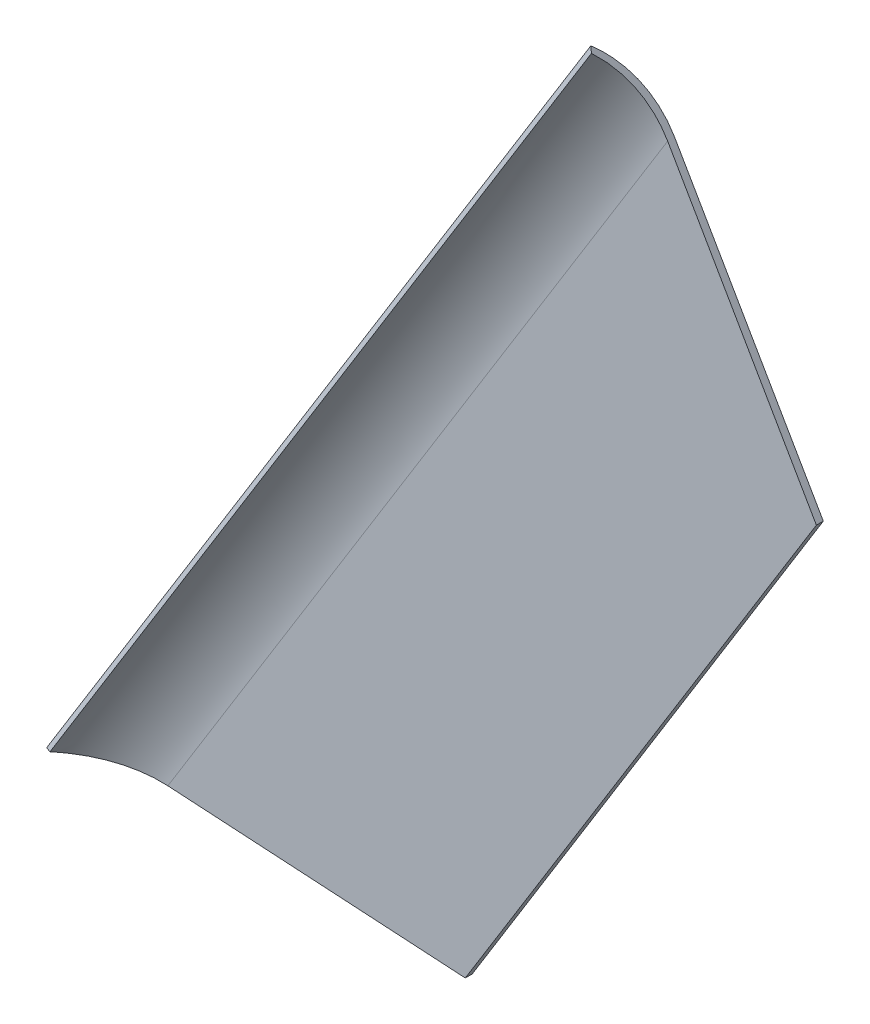
ISO-10303-21;
HEADER;
FILE_DESCRIPTION(('STEP AP214'),'2;1');
FILE_NAME('part.step','',(''),(''),'','','');
FILE_SCHEMA(('AUTOMOTIVE_DESIGN { 1 0 10303 214 1 1 1 1 }'));
ENDSEC;
DATA;
#1=APPLICATION_CONTEXT('core data for automotive mechanical design processes');
#2=APPLICATION_PROTOCOL_DEFINITION('international standard','automotive_design',2000,#1);
#3=PRODUCT_CONTEXT('',#1,'mechanical');
#4=PRODUCT('Part','Part','',(#3));
#5=PRODUCT_RELATED_PRODUCT_CATEGORY('part','',(#4));
#6=PRODUCT_DEFINITION_FORMATION('','',#4);
#7=PRODUCT_DEFINITION_CONTEXT('part definition',#1,'design');
#8=PRODUCT_DEFINITION('design','',#6,#7);
#9=PRODUCT_DEFINITION_SHAPE('','',#8);
#10=(LENGTH_UNIT() NAMED_UNIT(*) SI_UNIT(.MILLI.,.METRE.));
#11=(NAMED_UNIT(*) PLANE_ANGLE_UNIT() SI_UNIT($,.RADIAN.));
#12=(NAMED_UNIT(*) SI_UNIT($,.STERADIAN.) SOLID_ANGLE_UNIT());
#13=UNCERTAINTY_MEASURE_WITH_UNIT(LENGTH_MEASURE(1.E-05),#10,'distance_accuracy_value','');
#14=(GEOMETRIC_REPRESENTATION_CONTEXT(3) GLOBAL_UNCERTAINTY_ASSIGNED_CONTEXT((#13)) GLOBAL_UNIT_ASSIGNED_CONTEXT((#10,
#11,#12)) REPRESENTATION_CONTEXT('',''));
#15=CARTESIAN_POINT('',(0.,0.,0.));
#16=DIRECTION('',(0.,0.,1.));
#17=DIRECTION('',(1.,0.,0.));
#18=AXIS2_PLACEMENT_3D('',#15,#16,#17);
#19=CARTESIAN_POINT('',(-55.5895277832221,-99.2786334856322,1.5875));
#20=DIRECTION('',(0.0594751367438468,0.998229787228021,0.));
#21=DIRECTION('',(-0.998229787228021,0.0594751367438468,0.));
#22=AXIS2_PLACEMENT_3D('',#19,#20,#21);
#23=PLANE('',#22);
#24=DIRECTION('',(0.998229787228021,-0.0594751367438468,0.));
#25=VECTOR('',#24,1.);
#26=CARTESIAN_POINT('',(-55.5895277832221,-99.2786334856322,0.));
#27=LINE('',#26,#25);
#28=CARTESIAN_POINT('',(-123.629375350758,-95.2247780608739,0.));
#29=VERTEX_POINT('',#28);
#30=CARTESIAN_POINT('',(-55.5895277832221,-99.2786334856322,0.));
#31=VERTEX_POINT('',#30);
#32=EDGE_CURVE('E121',#29,#31,#27,.T.);
#33=ORIENTED_EDGE('',*,*,#32,.T.);
#34=DIRECTION('',(0.,0.,-1.));
#35=VECTOR('',#34,1.);
#36=CARTESIAN_POINT('',(-55.5895277832221,-99.2786334856322,1.5875));
#37=LINE('',#36,#35);
#38=CARTESIAN_POINT('',(-55.5895277832221,-99.2786334856322,1.5875));
#39=VERTEX_POINT('',#38);
#40=EDGE_CURVE('E134',#39,#31,#37,.T.);
#41=ORIENTED_EDGE('',*,*,#40,.F.);
#42=DIRECTION('',(0.998229787228021,-0.0594751367438468,0.));
#43=VECTOR('',#42,1.);
#44=CARTESIAN_POINT('',(-55.5895277832221,-99.2786334856322,1.5875));
#45=LINE('',#44,#43);
#46=CARTESIAN_POINT('',(-123.629375350758,-95.2247780608739,1.58750000000015));
#47=VERTEX_POINT('',#46);
#48=EDGE_CURVE('E149',#47,#39,#45,.T.);
#49=ORIENTED_EDGE('',*,*,#48,.F.);
#50=CARTESIAN_POINT('',(-123.629375350739,-95.2247780608751,1.58750000000014));
#51=CARTESIAN_POINT('',(-124.021621942274,-95.2014077708202,1.5875017836684));
#52=CARTESIAN_POINT('',(-124.413803393438,-95.1780413618683,1.59661545597952));
#53=CARTESIAN_POINT('',(-125.197315950276,-95.131359208065,1.63280106359393));
#54=CARTESIAN_POINT('',(-125.588647109861,-95.1080434600015,1.65987182491343));
#55=CARTESIAN_POINT('',(-126.7597976029,-95.038265602626,1.76757141818287));
#56=CARTESIAN_POINT('',(-127.537342907358,-94.9919389813422,1.87468834625455));
#57=CARTESIAN_POINT('',(-129.051564481433,-94.9017207406818,2.15183464576496));
#58=CARTESIAN_POINT('',(-129.788694564487,-94.8578020828251,2.31941606223591));
#59=CARTESIAN_POINT('',(-131.2465427355,-94.7709426037431,2.71530661956087));
#60=CARTESIAN_POINT('',(-131.96726054522,-94.7280017990954,2.94361678912631));
#61=CARTESIAN_POINT('',(-133.387370924641,-94.6433907605469,3.45824401496372));
#62=CARTESIAN_POINT('',(-134.086772118237,-94.6017200128291,3.74453724526653));
#63=CARTESIAN_POINT('',(-135.460509912841,-94.5198718810366,4.37259329154007));
#64=CARTESIAN_POINT('',(-136.134840803504,-94.4796948371876,4.71436865087235));
#65=CARTESIAN_POINT('',(-137.331923758195,-94.4083719080035,5.38232249283429));
#66=CARTESIAN_POINT('',(-137.859616528465,-94.3769316523909,5.69966379656906));
#67=CARTESIAN_POINT('',(-138.893615369694,-94.3153253736945,6.36785040769028));
#68=CARTESIAN_POINT('',(-139.399916609416,-94.2851596384586,6.71870322586202));
#69=CARTESIAN_POINT('',(-140.389690423424,-94.2261883137328,7.45283863979769));
#70=CARTESIAN_POINT('',(-140.873127624243,-94.1973848318155,7.83616907958481));
#71=CARTESIAN_POINT('',(-141.814271804994,-94.1413108901619,8.63310784203082));
#72=CARTESIAN_POINT('',(-142.271984547685,-94.1140400870771,9.04670933522815));
#73=CARTESIAN_POINT('',(-142.715899858538,-94.0875913433574,9.4746843536583));
#74=B_SPLINE_CURVE_WITH_KNOTS('',3,(#50,#51,#52,#53,#54,#55,#56,#57,#58,#59,#60,#61,#62,#63,#64,
#65,#66,#67,#68,#69,#70,#71,#72,#73),.UNSPECIFIED.,.F.,.F.,(4,2,2,2,2,2,2,2,2,2,2,4),(0.,
1.17859704859306,2.35711705142994,4.7124535194218,6.98152242443405,9.25062976866482,
11.5188065930223,13.7874969212132,15.6359613461725,17.4848410356645,19.3364933833065,
21.1877292592593),.UNSPECIFIED.);
#75=CARTESIAN_POINT('',(-142.715899858538,-94.0875913433575,9.47468435365827));
#76=VERTEX_POINT('',#75);
#77=EDGE_CURVE('E141',#47,#76,#74,.T.);
#78=ORIENTED_EDGE('',*,*,#77,.T.);
#79=DIRECTION('',(-0.945686977317728,0.0563446042308866,-0.320158439691543));
#80=VECTOR('',#79,1.);
#81=CARTESIAN_POINT('',(-144.438670833923,-93.9849476027575,8.89144731999463));
#82=LINE('',#81,#80);
#83=CARTESIAN_POINT('',(-143.84886680201,-94.0200884850463,9.09112305108765));
#84=VERTEX_POINT('',#83);
#85=EDGE_CURVE('E63',#76,#84,#82,.T.);
#86=ORIENTED_EDGE('',*,*,#85,.T.);
#87=CARTESIAN_POINT('',(-123.629375350797,-95.2247780608716,22.0306873384205));
#88=DIRECTION('',(0.0594751367438446,0.998229787228021,0.));
#89=DIRECTION('',(0.998229787228022,-0.0594751367438447,0.));
#90=AXIS2_PLACEMENT_3D('',#87,#88,#89);
#91=ELLIPSE('',#90,25.0270466695622,22.0306873384203);
#92=CARTESIAN_POINT('',(-143.46087523755,-94.0432052580047,8.6323164413553));
#93=VERTEX_POINT('',#92);
#94=EDGE_CURVE('E49',#84,#93,#91,.F.);
#95=ORIENTED_EDGE('',*,*,#94,.T.);
#96=CARTESIAN_POINT('',(-143.460875237551,-94.0432052580047,8.6323164413548));
#97=CARTESIAN_POINT('',(-142.91682645713,-94.0756200146318,8.06769626497914));
#98=CARTESIAN_POINT('',(-142.349568074535,-94.1094176134467,7.52555391455765));
#99=CARTESIAN_POINT('',(-141.172656346858,-94.1795387286795,6.48951692224252));
#100=CARTESIAN_POINT('',(-140.563000190152,-94.2158624126156,5.99562548535783));
#101=CARTESIAN_POINT('',(-139.305383986037,-94.2907919495498,5.05945339748532));
#102=CARTESIAN_POINT('',(-138.657423544247,-94.3293978260456,4.61717327802767));
#103=CARTESIAN_POINT('',(-137.327475042766,-94.4086369651696,3.78745684745309));
#104=CARTESIAN_POINT('',(-136.645488883392,-94.4492701145758,3.40001747813921));
#105=CARTESIAN_POINT('',(-135.259702007809,-94.531836137928,2.68714612990978));
#106=CARTESIAN_POINT('',(-134.556241033495,-94.5737487698456,2.36105417293373));
#107=CARTESIAN_POINT('',(-133.482784806124,-94.6377059435628,1.91664739681631));
#108=CARTESIAN_POINT('',(-133.121880157014,-94.6592088616603,1.7759536394577));
#109=CARTESIAN_POINT('',(-132.394450988439,-94.702549533143,1.50978830258103));
#110=CARTESIAN_POINT('',(-132.027925609112,-94.7243873377592,1.38431907882061));
#111=CARTESIAN_POINT('',(-131.012248601643,-94.7849019904771,1.06045815085895));
#112=CARTESIAN_POINT('',(-130.357887244356,-94.8238892374041,0.878205208541197));
#113=CARTESIAN_POINT('',(-129.037229031922,-94.9025748554666,0.563472739145026));
#114=CARTESIAN_POINT('',(-128.370929597479,-94.9422733802781,0.431004107513129));
#115=CARTESIAN_POINT('',(-127.027611186225,-95.0223091067431,0.217246052052937));
#116=CARTESIAN_POINT('',(-126.350561626709,-95.0626481305328,0.136148183878975));
#117=CARTESIAN_POINT('',(-124.992167923751,-95.1435820520298,0.0275045498095013));
#118=CARTESIAN_POINT('',(-124.310823510659,-95.1841769658029,-3.78193598088749E-05));
#119=CARTESIAN_POINT('',(-123.629375350758,-95.2247780608739,0.));
#120=B_SPLINE_CURVE_WITH_KNOTS('',3,(#96,#97,#98,#99,#100,#101,#102,#103,#104,#105,#106,#107,
#108,#109,#110,#111,#112,#113,#114,#115,#116,#117,#118,#119),.UNSPECIFIED.,.F.,.F.,(4,2,2,2,2,2,
2,2,2,2,2,4),(0.,2.35355931068634,4.70727484758173,7.06101462257999,9.41462308941714,
11.7412478440192,12.9048229948003,14.0685779615991,16.1077089884033,18.147286025662,
20.1944243211284,22.2416924509094),.UNSPECIFIED.);
#121=EDGE_CURVE('E136',#93,#29,#120,.T.);
#122=ORIENTED_EDGE('',*,*,#121,.T.);
#123=EDGE_LOOP('',(#33,#41,#49,#78,#86,#95,#122));
#124=FACE_BOUND('',#123,.T.);
#125=ADVANCED_FACE('F42',(#124),#23,.F.);
#126=CARTESIAN_POINT('',(-15.4287901610702,-34.3393726885127,1.5875));
#127=DIRECTION('',(-0.850498094594172,0.525978127959407,0.));
#128=DIRECTION('',(-0.525978127959407,-0.850498094594172,0.));
#129=AXIS2_PLACEMENT_3D('',#126,#127,#128);
#130=PLANE('',#129);
#131=DIRECTION('',(0.525978127959407,0.850498094594172,0.));
#132=VECTOR('',#131,1.);
#133=CARTESIAN_POINT('',(-15.4287901610702,-34.3393726885127,0.));
#134=LINE('',#133,#132);
#135=CARTESIAN_POINT('',(24.7319474610816,30.5998881086068,0.));
#136=VERTEX_POINT('',#135);
#137=EDGE_CURVE('E116',#31,#136,#134,.T.);
#138=ORIENTED_EDGE('',*,*,#137,.T.);
#139=DIRECTION('',(0.,0.,-1.));
#140=VECTOR('',#139,1.);
#141=CARTESIAN_POINT('',(24.7319474610816,30.5998881086068,1.5875));
#142=LINE('',#141,#140);
#143=CARTESIAN_POINT('',(24.7319474610816,30.5998881086068,1.5875));
#144=VERTEX_POINT('',#143);
#145=EDGE_CURVE('E113',#144,#136,#142,.T.);
#146=ORIENTED_EDGE('',*,*,#145,.F.);
#147=DIRECTION('',(0.525978127959407,0.850498094594172,0.));
#148=VECTOR('',#147,1.);
#149=CARTESIAN_POINT('',(-15.4287901610702,-34.3393726885127,1.5875));
#150=LINE('',#149,#148);
#151=EDGE_CURVE('E150',#39,#144,#150,.T.);
#152=ORIENTED_EDGE('',*,*,#151,.F.);
#153=ORIENTED_EDGE('',*,*,#40,.T.);
#154=EDGE_LOOP('',(#138,#146,#152,#153));
#155=FACE_BOUND('',#154,.T.);
#156=ADVANCED_FACE('F164',(#155),#130,.F.);
#157=CARTESIAN_POINT('',(24.7319474610816,30.5998881086068,1.5875));
#158=DIRECTION('',(-0.866535817478268,-0.499114893613955,0.));
#159=DIRECTION('',(0.499114893613955,-0.866535817478268,0.));
#160=AXIS2_PLACEMENT_3D('',#157,#158,#159);
#161=PLANE('',#160);
#162=DIRECTION('',(-0.499114893613955,0.866535817478268,0.));
#163=VECTOR('',#162,1.);
#164=CARTESIAN_POINT('',(24.7319474610816,30.5998881086068,0.));
#165=LINE('',#164,#163);
#166=CARTESIAN_POINT('',(-9.28797632268265,89.6634080389773,0.));
#167=VERTEX_POINT('',#166);
#168=EDGE_CURVE('E109',#136,#167,#165,.T.);
#169=ORIENTED_EDGE('',*,*,#168,.T.);
#170=CARTESIAN_POINT('',(-9.2879763226728,89.6634080389603,0.));
#171=CARTESIAN_POINT('',(-9.4840980452313,90.0039037832406,1.77738902717799E-06));
#172=CARTESIAN_POINT('',(-9.68018720540791,90.344342994505,0.00911530704622143));
#173=CARTESIAN_POINT('',(-10.0719403305954,91.024483216581,0.0453003414191478));
#174=CARTESIAN_POINT('',(-10.2676043226296,91.3641842743089,0.0723706692052562));
#175=CARTESIAN_POINT('',(-10.8531811517508,92.3808305471635,0.180069673825677));
#176=CARTESIAN_POINT('',(-11.2419569315614,93.0558016660067,0.287187140692829));
#177=CARTESIAN_POINT('',(-11.9990741900495,94.3702669943412,0.564335898211012));
#178=CARTESIAN_POINT('',(-12.3676425685159,95.0101551347621,0.731919228246438));
#179=CARTESIAN_POINT('',(-13.0965661387539,96.275672132746,1.12781038506725));
#180=CARTESIAN_POINT('',(-13.4569213350674,96.9013009981944,1.35611817827059));
#181=CARTESIAN_POINT('',(-14.1669649501313,98.1340396567616,1.87073773757309));
#182=CARTESIAN_POINT('',(-14.5166578794126,98.7411572808162,2.15702457343415));
#183=CARTESIAN_POINT('',(-15.2035222825873,99.9336534669991,2.78507108129403));
#184=CARTESIAN_POINT('',(-15.5406901988521,100.519025852568,3.12684636851317));
#185=CARTESIAN_POINT('',(-16.1773740794302,101.624401376302,3.83736836234786));
#186=CARTESIAN_POINT('',(-16.4778764734541,102.146117099458,4.2025754304903));
#187=CARTESIAN_POINT('',(-17.0647643205882,103.165039489656,4.97641964611751));
#188=CARTESIAN_POINT('',(-17.3511448535,103.66223761452,5.38507177597073));
#189=CARTESIAN_POINT('',(-17.9088400617645,104.630477351263,6.2444131960601));
#190=CARTESIAN_POINT('',(-18.1801166374104,105.101452816527,6.69520173331649));
#191=CARTESIAN_POINT('',(-18.7052923999257,106.013234080748,7.63538902462193));
#192=CARTESIAN_POINT('',(-18.9591973272857,106.454049846029,8.12477490790547));
#193=CARTESIAN_POINT('',(-19.2037262660779,106.878587535817,8.63231644135478));
#194=B_SPLINE_CURVE_WITH_KNOTS('',3,(#170,#171,#172,#173,#174,#175,#176,#177,#178,#179,#180,
#181,#182,#183,#184,#185,#186,#187,#188,#189,#190,#191,#192,#193),.UNSPECIFIED.,.F.,.F.,(4,2,2,
2,2,2,2,2,2,2,2,4),(0.,1.17858762618825,2.35709801267911,4.71245350527907,6.98154225710793,
9.25062975408001,11.5187436364574,13.787496907451,15.8981376749522,18.0095086890667,
20.1259844945831,22.2417574949165),.UNSPECIFIED.);
#195=CARTESIAN_POINT('',(-19.2037262660776,106.878587535816,8.6323164413553));
#196=VERTEX_POINT('',#195);
#197=EDGE_CURVE('E55',#167,#196,#194,.T.);
#198=ORIENTED_EDGE('',*,*,#197,.T.);
#199=CARTESIAN_POINT('',(-9.28797632270181,89.6634080390105,22.0306873384205));
#200=DIRECTION('',(-0.866535817478268,-0.499114893613955,0.));
#201=DIRECTION('',(-0.499114893613955,0.866535817478268,0.));
#202=AXIS2_PLACEMENT_3D('',#199,#200,#201);
#203=ELLIPSE('',#202,25.0270466695622,22.0306873384203);
#204=CARTESIAN_POINT('',(-19.3977220483074,107.215392339465,9.09112305108765));
#205=VERTEX_POINT('',#204);
#206=EDGE_CURVE('E11',#196,#205,#203,.F.);
#207=ORIENTED_EDGE('',*,*,#206,.T.);
#208=DIRECTION('',(0.472843488658811,-0.820924849622206,0.320158439691543));
#209=VECTOR('',#208,1.);
#210=CARTESIAN_POINT('',(31.3165611962321,19.1680440206594,43.4293473961046));
#211=LINE('',#210,#209);
#212=CARTESIAN_POINT('',(-18.8312385765715,106.231894903205,9.47468435365827));
#213=VERTEX_POINT('',#212);
#214=EDGE_CURVE('E140',#205,#213,#211,.T.);
#215=ORIENTED_EDGE('',*,*,#214,.T.);
#216=CARTESIAN_POINT('',(-18.8312385765715,106.231894903205,9.47468435365828));
#217=CARTESIAN_POINT('',(-18.5490363266695,105.741950883417,8.93052636663094));
#218=CARTESIAN_POINT('',(-18.2556728970299,105.232629437447,8.4096175700572));
#219=CARTESIAN_POINT('',(-17.6486505069443,104.178750561559,7.41752728688631));
#220=CARTESIAN_POINT('',(-17.33498959052,103.634189735781,6.94635060429671));
#221=CARTESIAN_POINT('',(-16.6894446334835,102.513430098628,6.057046432975));
#222=CARTESIAN_POINT('',(-16.3575600462907,101.937230338309,5.63892053663645));
#223=CARTESIAN_POINT('',(-15.6777288257376,100.756944776836,4.85891211927881));
#224=CARTESIAN_POINT('',(-15.329783134061,100.152860610579,4.49702630624898));
#225=CARTESIAN_POINT('',(-14.6265585409098,98.9319607626806,3.8386547188251));
#226=CARTESIAN_POINT('',(-14.2715305852776,98.3155807594035,3.54109273218377));
#227=CARTESIAN_POINT('',(-13.5503282371138,97.0634689223706,3.00595231932942));
#228=CARTESIAN_POINT('',(-13.1841534339252,96.427736375655,2.76837610603395));
#229=CARTESIAN_POINT('',(-12.5274065929442,95.2875286439139,2.40290833632361));
#230=CARTESIAN_POINT('',(-12.2385732967039,94.7860721663075,2.26235981456331));
#231=CARTESIAN_POINT('',(-11.6568324404641,93.776085698518,2.0199153294529));
#232=CARTESIAN_POINT('',(-11.3639243381485,93.2675547667956,1.91802456308383));
#233=CARTESIAN_POINT('',(-10.7745772384045,92.2443627575223,1.75388208277965));
#234=CARTESIAN_POINT('',(-10.4781310974705,91.7296892778099,1.69173298825229));
#235=CARTESIAN_POINT('',(-9.88379352589987,90.6978330859221,1.60853016323841));
#236=CARTESIAN_POINT('',(-9.58590201390663,90.1806502324997,1.58747877359239));
#237=CARTESIAN_POINT('',(-9.28797632268263,89.6634080389773,1.58750000000014));
#238=B_SPLINE_CURVE_WITH_KNOTS('',3,(#216,#217,#218,#219,#220,#221,#222,#223,#224,#225,#226,
#227,#228,#229,#230,#231,#232,#233,#234,#235,#236,#237),.UNSPECIFIED.,.F.,.F.,(4,2,2,2,2,2,2,2,
2,2,4),(0.,2.35350162801199,4.70723039119286,7.06102978812951,9.41469135358706,11.7252545789483,
14.0359030301692,15.8212210108782,17.6067789170242,19.3969289997431,21.1871810427433),.UNSPECIFIED.);
#239=CARTESIAN_POINT('',(-9.28797632268265,89.6634080389773,1.58750000000015));
#240=VERTEX_POINT('',#239);
#241=EDGE_CURVE('E105',#213,#240,#238,.T.);
#242=ORIENTED_EDGE('',*,*,#241,.T.);
#243=DIRECTION('',(-0.499114893613955,0.866535817478268,0.));
#244=VECTOR('',#243,1.);
#245=CARTESIAN_POINT('',(24.7319474610816,30.5998881086068,1.5875));
#246=LINE('',#245,#244);
#247=EDGE_CURVE('E129',#144,#240,#246,.T.);
#248=ORIENTED_EDGE('',*,*,#247,.F.);
#249=ORIENTED_EDGE('',*,*,#145,.T.);
#250=EDGE_LOOP('',(#169,#198,#207,#215,#242,#248,#249));
#251=FACE_BOUND('',#250,.T.);
#252=ADVANCED_FACE('F110',(#251),#161,.F.);
#253=CARTESIAN_POINT('',(0.,0.,1.5875));
#254=DIRECTION('',(0.,0.,-1.));
#255=DIRECTION('',(-1.,0.,0.));
#256=AXIS2_PLACEMENT_3D('',#253,#254,#255);
#257=PLANE('',#256);
#258=DIRECTION('',(-0.525978127959408,-0.850498094594172,0.));
#259=VECTOR('',#258,1.);
#260=CARTESIAN_POINT('',(-9.28797632268265,89.6634080389773,1.5875));
#261=LINE('',#260,#259);
#262=EDGE_CURVE('E115',#240,#47,#261,.T.);
#263=ORIENTED_EDGE('',*,*,#262,.T.);
#264=ORIENTED_EDGE('',*,*,#48,.T.);
#265=ORIENTED_EDGE('',*,*,#151,.T.);
#266=ORIENTED_EDGE('',*,*,#247,.T.);
#267=EDGE_LOOP('',(#263,#264,#265,#266));
#268=FACE_BOUND('',#267,.T.);
#269=ADVANCED_FACE('F155',(#268),#257,.F.);
#270=CARTESIAN_POINT('',(0.,0.,0.));
#271=DIRECTION('',(0.,0.,-1.));
#272=DIRECTION('',(-1.,0.,0.));
#273=AXIS2_PLACEMENT_3D('',#270,#271,#272);
#274=PLANE('',#273);
#275=DIRECTION('',(-0.525978127959408,-0.850498094594172,0.));
#276=VECTOR('',#275,1.);
#277=CARTESIAN_POINT('',(-9.28797632268265,89.6634080389773,0.));
#278=LINE('',#277,#276);
#279=EDGE_CURVE('E102',#167,#29,#278,.T.);
#280=ORIENTED_EDGE('',*,*,#279,.F.);
#281=ORIENTED_EDGE('',*,*,#168,.F.);
#282=ORIENTED_EDGE('',*,*,#137,.F.);
#283=ORIENTED_EDGE('',*,*,#32,.F.);
#284=EDGE_LOOP('',(#280,#281,#282,#283));
#285=FACE_BOUND('',#284,.T.);
#286=ADVANCED_FACE('F119',(#285),#274,.T.);
#287=CARTESIAN_POINT('',(-131.38389483753,-103.722421857007,24.5953041144352));
#288=DIRECTION('',(0.525978127959407,0.850498094594172,0.));
#289=DIRECTION('',(0.304823191149453,-0.188513451656709,-0.933566013028504));
#290=AXIS2_PLACEMENT_3D('',#287,#288,#289);
#291=ELLIPSE('',#290,25.,21.6506350946106);
#292=DIRECTION('',(0.525978127959407,0.850498094594172,0.));
#293=VECTOR('',#292,1.);
#294=SURFACE_OF_LINEAR_EXTRUSION('',#291,#293);
#295=ORIENTED_EDGE('',*,*,#197,.F.);
#296=ORIENTED_EDGE('',*,*,#279,.T.);
#297=ORIENTED_EDGE('',*,*,#121,.F.);
#298=DIRECTION('',(0.525978127959407,0.850498094594172,0.));
#299=VECTOR('',#298,1.);
#300=CARTESIAN_POINT('',(-144.449676106943,-95.642080212395,8.6323164413553));
#301=LINE('',#300,#299);
#302=EDGE_CURVE('E104',#93,#196,#301,.T.);
#303=ORIENTED_EDGE('',*,*,#302,.T.);
#304=EDGE_LOOP('',(#295,#296,#297,#303));
#305=FACE_BOUND('',#304,.T.);
#306=ADVANCED_FACE('F99',(#305),#294,.T.);
#307=CARTESIAN_POINT('',(-131.383894837538,-103.722421857003,26.1828041144352));
#308=DIRECTION('',(-0.525978127959407,-0.850498094594172,0.));
#309=DIRECTION('',(0.304823191149471,-0.188513451656721,-0.933566013028496));
#310=AXIS2_PLACEMENT_3D('',#307,#308,#309);
#311=ELLIPSE('',#310,25.,21.6506350946106);
#312=DIRECTION('',(0.525978127959407,0.850498094594172,0.));
#313=VECTOR('',#312,1.);
#314=SURFACE_OF_LINEAR_EXTRUSION('',#311,#313);
#315=ORIENTED_EDGE('',*,*,#241,.F.);
#316=DIRECTION('',(0.525978127959407,0.850498094594172,0.));
#317=VECTOR('',#316,1.);
#318=CARTESIAN_POINT('',(-143.890944572684,-95.987619571377,9.47468435365827));
#319=LINE('',#318,#317);
#320=EDGE_CURVE('E122',#76,#213,#319,.T.);
#321=ORIENTED_EDGE('',*,*,#320,.F.);
#322=ORIENTED_EDGE('',*,*,#77,.F.);
#323=ORIENTED_EDGE('',*,*,#262,.F.);
#324=EDGE_LOOP('',(#315,#321,#322,#323));
#325=FACE_BOUND('',#324,.T.);
#326=ADVANCED_FACE('F158',(#325),#314,.T.);
#327=CARTESIAN_POINT('',(-144.617619330093,-95.5382181782793,9.14666735003998));
#328=DIRECTION('',(-0.304823191149448,0.188513451656706,0.933566013028506));
#329=DIRECTION('',(0.950609870299831,0.,0.310388264096017));
#330=AXIS2_PLACEMENT_3D('',#327,#328,#329);
#331=PLANE('',#330);
#332=ORIENTED_EDGE('',*,*,#214,.F.);
#333=DIRECTION('',(0.525978127959407,0.850498094594172,0.));
#334=VECTOR('',#333,1.);
#335=CARTESIAN_POINT('',(-144.740669780288,-95.4621194240914,9.09112305108765));
#336=LINE('',#335,#334);
#337=EDGE_CURVE('E126',#84,#205,#336,.T.);
#338=ORIENTED_EDGE('',*,*,#337,.F.);
#339=ORIENTED_EDGE('',*,*,#85,.F.);
#340=ORIENTED_EDGE('',*,*,#320,.T.);
#341=EDGE_LOOP('',(#332,#338,#339,#340));
#342=FACE_BOUND('',#341,.T.);
#343=ADVANCED_FACE('F195',(#342),#331,.T.);
#344=CARTESIAN_POINT('',(-129.576051191878,-104.840456362231,22.0306873384205));
#345=DIRECTION('',(0.525978127959407,0.850498094594172,0.));
#346=DIRECTION('',(-0.850498094594172,0.525978127959407,0.));
#347=AXIS2_PLACEMENT_3D('',#344,#345,#346);
#348=CYLINDRICAL_SURFACE('',#347,22.0306873384203);
#349=ORIENTED_EDGE('',*,*,#206,.F.);
#350=ORIENTED_EDGE('',*,*,#302,.F.);
#351=ORIENTED_EDGE('',*,*,#94,.F.);
#352=ORIENTED_EDGE('',*,*,#337,.T.);
#353=EDGE_LOOP('',(#349,#350,#351,#352));
#354=FACE_BOUND('',#353,.T.);
#355=ADVANCED_FACE('F143',(#354),#348,.T.);
#356=CLOSED_SHELL('',(#125,#156,#252,#269,#286,#306,#326,#343,#355));
#357=MANIFOLD_SOLID_BREP('B2',#356);
#358=ADVANCED_BREP_SHAPE_REPRESENTATION('',(#18,#357),#14);
#359=SHAPE_DEFINITION_REPRESENTATION(#9,#358);
ENDSEC;
END-ISO-10303-21;
